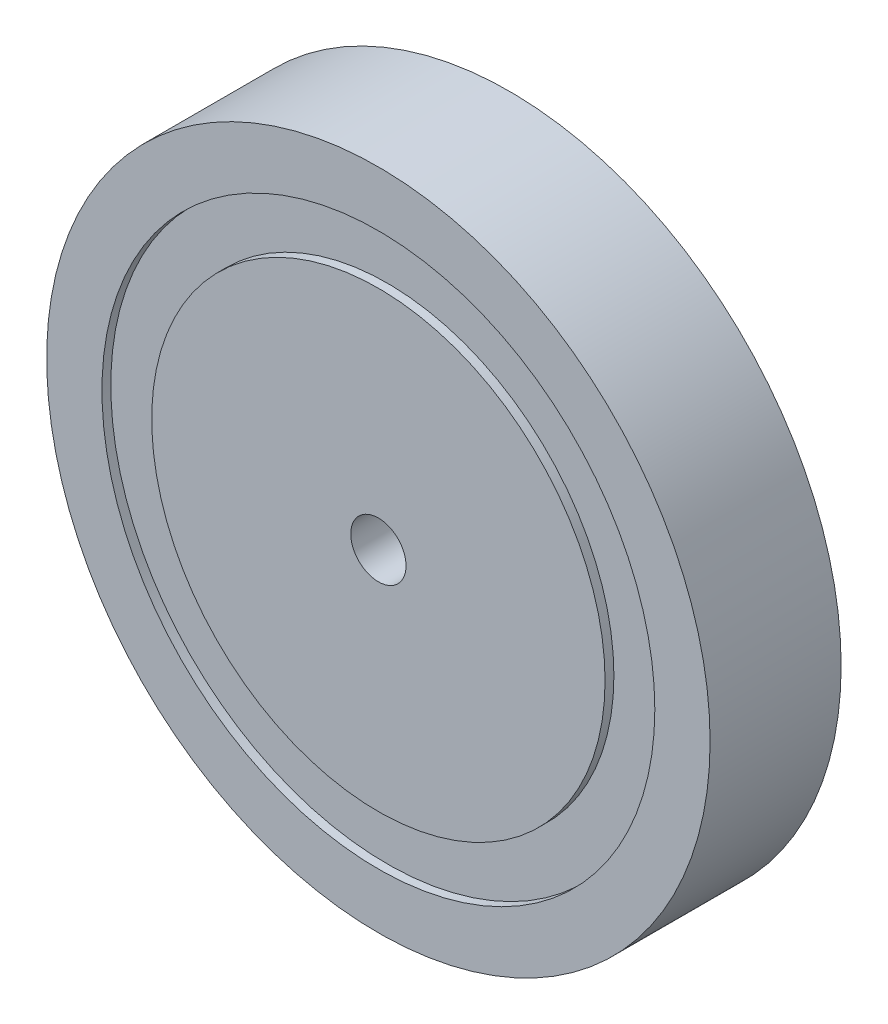
ISO-10303-21;
HEADER;
FILE_DESCRIPTION(('STEP AP214'),'2;1');
FILE_NAME('part.step','',(''),(''),'','','');
FILE_SCHEMA(('AUTOMOTIVE_DESIGN { 1 0 10303 214 1 1 1 1 }'));
ENDSEC;
DATA;
#1=APPLICATION_CONTEXT('core data for automotive mechanical design processes');
#2=APPLICATION_PROTOCOL_DEFINITION('international standard','automotive_design',2000,#1);
#3=PRODUCT_CONTEXT('',#1,'mechanical');
#4=PRODUCT('Part','Part','',(#3));
#5=PRODUCT_RELATED_PRODUCT_CATEGORY('part','',(#4));
#6=PRODUCT_DEFINITION_FORMATION('','',#4);
#7=PRODUCT_DEFINITION_CONTEXT('part definition',#1,'design');
#8=PRODUCT_DEFINITION('design','',#6,#7);
#9=PRODUCT_DEFINITION_SHAPE('','',#8);
#10=(LENGTH_UNIT() NAMED_UNIT(*) SI_UNIT(.MILLI.,.METRE.));
#11=(NAMED_UNIT(*) PLANE_ANGLE_UNIT() SI_UNIT($,.RADIAN.));
#12=(NAMED_UNIT(*) SI_UNIT($,.STERADIAN.) SOLID_ANGLE_UNIT());
#13=UNCERTAINTY_MEASURE_WITH_UNIT(LENGTH_MEASURE(1.E-05),#10,'distance_accuracy_value','');
#14=(GEOMETRIC_REPRESENTATION_CONTEXT(3) GLOBAL_UNCERTAINTY_ASSIGNED_CONTEXT((#13)) GLOBAL_UNIT_ASSIGNED_CONTEXT((#10,
#11,#12)) REPRESENTATION_CONTEXT('',''));
#15=CARTESIAN_POINT('',(0.,0.,0.));
#16=DIRECTION('',(0.,0.,1.));
#17=DIRECTION('',(1.,0.,0.));
#18=AXIS2_PLACEMENT_3D('',#15,#16,#17);
#19=CARTESIAN_POINT('',(0.,0.,11.85));
#20=DIRECTION('',(0.,0.,-1.));
#21=DIRECTION('',(-1.,0.,0.));
#22=AXIS2_PLACEMENT_3D('',#19,#20,#21);
#23=CYLINDRICAL_SURFACE('',#22,5.);
#24=CARTESIAN_POINT('',(0.,0.,11.85));
#25=DIRECTION('',(0.,0.,1.));
#26=DIRECTION('',(1.,0.,0.));
#27=AXIS2_PLACEMENT_3D('',#24,#25,#26);
#28=CIRCLE('',#27,5.);
#29=CARTESIAN_POINT('',(5.,0.,11.85));
#30=VERTEX_POINT('',#29);
#31=EDGE_CURVE('E10',#30,#30,#28,.T.);
#32=ORIENTED_EDGE('',*,*,#31,.T.);
#33=EDGE_LOOP('',(#32));
#34=FACE_BOUND('',#33,.T.);
#35=CARTESIAN_POINT('',(0.,0.,-8.85));
#36=DIRECTION('',(0.,0.,-1.));
#37=DIRECTION('',(-1.,0.,0.));
#38=AXIS2_PLACEMENT_3D('',#35,#36,#37);
#39=CIRCLE('',#38,5.);
#40=CARTESIAN_POINT('',(-5.,0.,-8.85));
#41=VERTEX_POINT('',#40);
#42=EDGE_CURVE('E35',#41,#41,#39,.T.);
#43=ORIENTED_EDGE('',*,*,#42,.T.);
#44=EDGE_LOOP('',(#43));
#45=FACE_BOUND('',#44,.T.);
#46=ADVANCED_FACE('F31',(#34,#45),#23,.F.);
#47=CARTESIAN_POINT('',(0.,0.,11.85));
#48=DIRECTION('',(0.,0.,1.));
#49=DIRECTION('',(1.,0.,0.));
#50=AXIS2_PLACEMENT_3D('',#47,#48,#49);
#51=PLANE('',#50);
#52=ORIENTED_EDGE('',*,*,#31,.F.);
#53=EDGE_LOOP('',(#52));
#54=FACE_BOUND('',#53,.T.);
#55=CARTESIAN_POINT('',(0.,0.,11.85));
#56=DIRECTION('',(0.,0.,1.));
#57=DIRECTION('',(1.,0.,0.));
#58=AXIS2_PLACEMENT_3D('',#55,#56,#57);
#59=CIRCLE('',#58,41.);
#60=CARTESIAN_POINT('',(41.,0.,11.85));
#61=VERTEX_POINT('',#60);
#62=EDGE_CURVE('E59',#61,#61,#59,.T.);
#63=ORIENTED_EDGE('',*,*,#62,.T.);
#64=EDGE_LOOP('',(#63));
#65=FACE_BOUND('',#64,.T.);
#66=ADVANCED_FACE('F86',(#54,#65),#51,.T.);
#67=CARTESIAN_POINT('',(0.,0.,11.85));
#68=DIRECTION('',(0.,0.,-1.));
#69=DIRECTION('',(-1.,0.,0.));
#70=AXIS2_PLACEMENT_3D('',#67,#68,#69);
#71=CYLINDRICAL_SURFACE('',#70,60.);
#72=CARTESIAN_POINT('',(0.,0.,11.85));
#73=DIRECTION('',(0.,0.,1.));
#74=DIRECTION('',(1.,0.,0.));
#75=AXIS2_PLACEMENT_3D('',#72,#73,#74);
#76=CIRCLE('',#75,60.);
#77=CARTESIAN_POINT('',(60.,0.,11.85));
#78=VERTEX_POINT('',#77);
#79=EDGE_CURVE('E39',#78,#78,#76,.T.);
#80=ORIENTED_EDGE('',*,*,#79,.F.);
#81=EDGE_LOOP('',(#80));
#82=FACE_BOUND('',#81,.T.);
#83=CARTESIAN_POINT('',(0.,0.,-11.85));
#84=DIRECTION('',(0.,0.,1.));
#85=DIRECTION('',(1.,0.,0.));
#86=AXIS2_PLACEMENT_3D('',#83,#84,#85);
#87=CIRCLE('',#86,60.);
#88=CARTESIAN_POINT('',(60.,0.,-11.85));
#89=VERTEX_POINT('',#88);
#90=EDGE_CURVE('E44',#89,#89,#87,.T.);
#91=ORIENTED_EDGE('',*,*,#90,.T.);
#92=EDGE_LOOP('',(#91));
#93=FACE_BOUND('',#92,.T.);
#94=ADVANCED_FACE('F33',(#82,#93),#71,.T.);
#95=CARTESIAN_POINT('',(0.,0.,11.85));
#96=DIRECTION('',(0.,0.,1.));
#97=DIRECTION('',(1.,0.,0.));
#98=AXIS2_PLACEMENT_3D('',#95,#96,#97);
#99=CIRCLE('',#98,50.);
#100=CARTESIAN_POINT('',(50.,0.,11.85));
#101=VERTEX_POINT('',#100);
#102=EDGE_CURVE('E52',#101,#101,#99,.T.);
#103=ORIENTED_EDGE('',*,*,#102,.F.);
#104=EDGE_LOOP('',(#103));
#105=FACE_BOUND('',#104,.T.);
#106=ORIENTED_EDGE('',*,*,#79,.T.);
#107=EDGE_LOOP('',(#106));
#108=FACE_BOUND('',#107,.T.);
#109=ADVANCED_FACE('F92',(#105,#108),#51,.T.);
#110=CARTESIAN_POINT('',(0.,0.,-11.85));
#111=DIRECTION('',(0.,0.,1.));
#112=DIRECTION('',(1.,0.,0.));
#113=AXIS2_PLACEMENT_3D('',#110,#111,#112);
#114=PLANE('',#113);
#115=CARTESIAN_POINT('',(0.,0.,-11.85));
#116=DIRECTION('',(0.,0.,-1.));
#117=DIRECTION('',(-1.,0.,0.));
#118=AXIS2_PLACEMENT_3D('',#115,#116,#117);
#119=CIRCLE('',#118,24.75);
#120=CARTESIAN_POINT('',(-24.75,0.,-11.85));
#121=VERTEX_POINT('',#120);
#122=EDGE_CURVE('E64',#121,#121,#119,.T.);
#123=ORIENTED_EDGE('',*,*,#122,.F.);
#124=EDGE_LOOP('',(#123));
#125=FACE_BOUND('',#124,.T.);
#126=ORIENTED_EDGE('',*,*,#90,.F.);
#127=EDGE_LOOP('',(#126));
#128=FACE_BOUND('',#127,.T.);
#129=ADVANCED_FACE('F94',(#125,#128),#114,.F.);
#130=CARTESIAN_POINT('',(0.,0.,10.25));
#131=DIRECTION('',(0.,0.,1.));
#132=DIRECTION('',(1.,0.,0.));
#133=AXIS2_PLACEMENT_3D('',#130,#131,#132);
#134=CYLINDRICAL_SURFACE('',#133,50.);
#135=CARTESIAN_POINT('',(0.,0.,10.25));
#136=DIRECTION('',(0.,0.,1.));
#137=DIRECTION('',(1.,0.,0.));
#138=AXIS2_PLACEMENT_3D('',#135,#136,#137);
#139=CIRCLE('',#138,50.);
#140=CARTESIAN_POINT('',(50.,0.,10.25));
#141=VERTEX_POINT('',#140);
#142=EDGE_CURVE('E48',#141,#141,#139,.T.);
#143=ORIENTED_EDGE('',*,*,#142,.F.);
#144=EDGE_LOOP('',(#143));
#145=FACE_BOUND('',#144,.T.);
#146=ORIENTED_EDGE('',*,*,#102,.T.);
#147=EDGE_LOOP('',(#146));
#148=FACE_BOUND('',#147,.T.);
#149=ADVANCED_FACE('F96',(#145,#148),#134,.F.);
#150=CARTESIAN_POINT('',(0.,0.,10.25));
#151=DIRECTION('',(0.,0.,1.));
#152=DIRECTION('',(1.,0.,0.));
#153=AXIS2_PLACEMENT_3D('',#150,#151,#152);
#154=PLANE('',#153);
#155=CARTESIAN_POINT('',(0.,0.,10.25));
#156=DIRECTION('',(0.,0.,1.));
#157=DIRECTION('',(1.,0.,0.));
#158=AXIS2_PLACEMENT_3D('',#155,#156,#157);
#159=CIRCLE('',#158,41.);
#160=CARTESIAN_POINT('',(41.,0.,10.25));
#161=VERTEX_POINT('',#160);
#162=EDGE_CURVE('E57',#161,#161,#159,.T.);
#163=ORIENTED_EDGE('',*,*,#162,.F.);
#164=EDGE_LOOP('',(#163));
#165=FACE_BOUND('',#164,.T.);
#166=ORIENTED_EDGE('',*,*,#142,.T.);
#167=EDGE_LOOP('',(#166));
#168=FACE_BOUND('',#167,.T.);
#169=ADVANCED_FACE('F103',(#165,#168),#154,.T.);
#170=CARTESIAN_POINT('',(0.,0.,10.25));
#171=DIRECTION('',(0.,0.,1.));
#172=DIRECTION('',(1.,0.,0.));
#173=AXIS2_PLACEMENT_3D('',#170,#171,#172);
#174=CYLINDRICAL_SURFACE('',#173,41.);
#175=ORIENTED_EDGE('',*,*,#162,.T.);
#176=EDGE_LOOP('',(#175));
#177=FACE_BOUND('',#176,.T.);
#178=ORIENTED_EDGE('',*,*,#62,.F.);
#179=EDGE_LOOP('',(#178));
#180=FACE_BOUND('',#179,.T.);
#181=ADVANCED_FACE('F82',(#177,#180),#174,.T.);
#182=CARTESIAN_POINT('',(0.,0.,-8.85));
#183=DIRECTION('',(0.,0.,-1.));
#184=DIRECTION('',(-1.,0.,0.));
#185=AXIS2_PLACEMENT_3D('',#182,#183,#184);
#186=CYLINDRICAL_SURFACE('',#185,24.75);
#187=CARTESIAN_POINT('',(0.,0.,-8.85));
#188=DIRECTION('',(0.,0.,-1.));
#189=DIRECTION('',(-1.,0.,0.));
#190=AXIS2_PLACEMENT_3D('',#187,#188,#189);
#191=CIRCLE('',#190,24.75);
#192=CARTESIAN_POINT('',(-24.75,0.,-8.85));
#193=VERTEX_POINT('',#192);
#194=EDGE_CURVE('E67',#193,#193,#191,.T.);
#195=ORIENTED_EDGE('',*,*,#194,.F.);
#196=EDGE_LOOP('',(#195));
#197=FACE_BOUND('',#196,.T.);
#198=ORIENTED_EDGE('',*,*,#122,.T.);
#199=EDGE_LOOP('',(#198));
#200=FACE_BOUND('',#199,.T.);
#201=ADVANCED_FACE('F77',(#197,#200),#186,.F.);
#202=CARTESIAN_POINT('',(0.,0.,-8.85));
#203=DIRECTION('',(0.,0.,-1.));
#204=DIRECTION('',(-1.,0.,0.));
#205=AXIS2_PLACEMENT_3D('',#202,#203,#204);
#206=PLANE('',#205);
#207=ORIENTED_EDGE('',*,*,#42,.F.);
#208=EDGE_LOOP('',(#207));
#209=FACE_BOUND('',#208,.T.);
#210=ORIENTED_EDGE('',*,*,#194,.T.);
#211=EDGE_LOOP('',(#210));
#212=FACE_BOUND('',#211,.T.);
#213=ADVANCED_FACE('F75',(#209,#212),#206,.T.);
#214=CLOSED_SHELL('',(#46,#66,#94,#109,#129,#149,#169,#181,#201,#213));
#215=MANIFOLD_SOLID_BREP('B2',#214);
#216=ADVANCED_BREP_SHAPE_REPRESENTATION('',(#18,#215),#14);
#217=SHAPE_DEFINITION_REPRESENTATION(#9,#216);
ENDSEC;
END-ISO-10303-21;
